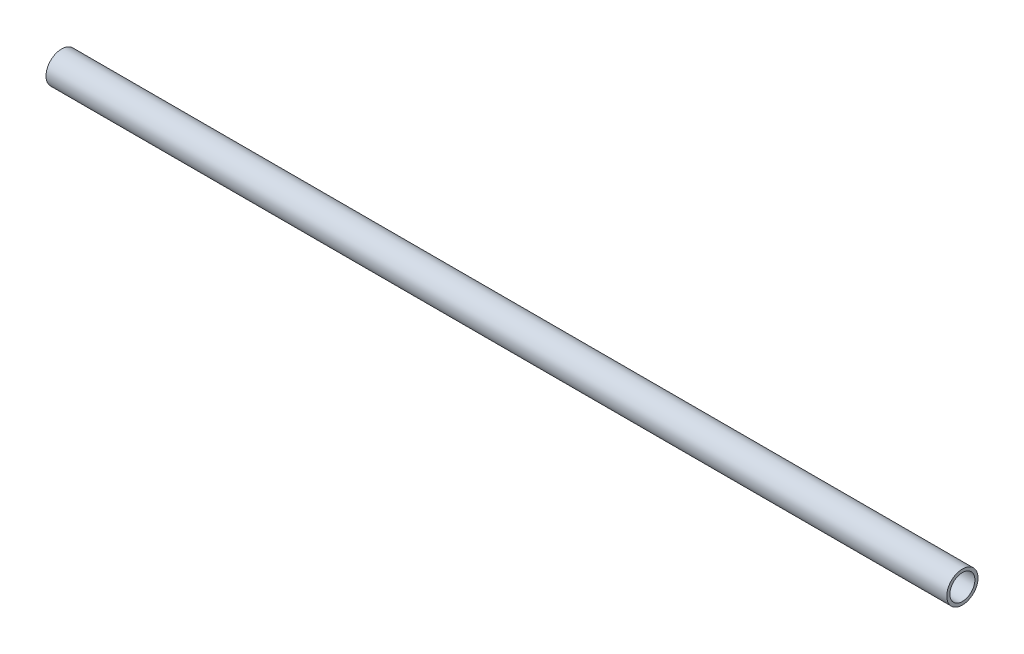
ISO-10303-21;
HEADER;
FILE_DESCRIPTION(('STEP AP214'),'2;1');
FILE_NAME('part.step','',(''),(''),'','','');
FILE_SCHEMA(('AUTOMOTIVE_DESIGN { 1 0 10303 214 1 1 1 1 }'));
ENDSEC;
DATA;
#1=APPLICATION_CONTEXT('core data for automotive mechanical design processes');
#2=APPLICATION_PROTOCOL_DEFINITION('international standard','automotive_design',2000,#1);
#3=PRODUCT_CONTEXT('',#1,'mechanical');
#4=PRODUCT('Part','Part','',(#3));
#5=PRODUCT_RELATED_PRODUCT_CATEGORY('part','',(#4));
#6=PRODUCT_DEFINITION_FORMATION('','',#4);
#7=PRODUCT_DEFINITION_CONTEXT('part definition',#1,'design');
#8=PRODUCT_DEFINITION('design','',#6,#7);
#9=PRODUCT_DEFINITION_SHAPE('','',#8);
#10=(LENGTH_UNIT() NAMED_UNIT(*) SI_UNIT(.MILLI.,.METRE.));
#11=(NAMED_UNIT(*) PLANE_ANGLE_UNIT() SI_UNIT($,.RADIAN.));
#12=(NAMED_UNIT(*) SI_UNIT($,.STERADIAN.) SOLID_ANGLE_UNIT());
#13=UNCERTAINTY_MEASURE_WITH_UNIT(LENGTH_MEASURE(1.E-05),#10,'distance_accuracy_value','');
#14=(GEOMETRIC_REPRESENTATION_CONTEXT(3) GLOBAL_UNCERTAINTY_ASSIGNED_CONTEXT((#13)) GLOBAL_UNIT_ASSIGNED_CONTEXT((#10,
#11,#12)) REPRESENTATION_CONTEXT('',''));
#15=CARTESIAN_POINT('',(0.,0.,0.));
#16=DIRECTION('',(0.,0.,1.));
#17=DIRECTION('',(1.,0.,0.));
#18=AXIS2_PLACEMENT_3D('',#15,#16,#17);
#19=CARTESIAN_POINT('',(-444.782693127749,0.,0.));
#20=DIRECTION('',(-1.,0.,0.));
#21=DIRECTION('',(0.,0.,1.));
#22=AXIS2_PLACEMENT_3D('',#19,#20,#21);
#23=CYLINDRICAL_SURFACE('',#22,12.6999999999999);
#24=CARTESIAN_POINT('',(457.2,0.,0.));
#25=DIRECTION('',(-1.,0.,0.));
#26=DIRECTION('',(0.,0.,1.));
#27=AXIS2_PLACEMENT_3D('',#24,#25,#26);
#28=CIRCLE('',#27,12.6999999999999);
#29=CARTESIAN_POINT('',(457.2,0.,12.6999999999999));
#30=VERTEX_POINT('',#29);
#31=EDGE_CURVE('E10',#30,#30,#28,.T.);
#32=ORIENTED_EDGE('',*,*,#31,.F.);
#33=EDGE_LOOP('',(#32));
#34=FACE_BOUND('',#33,.T.);
#35=CARTESIAN_POINT('',(-457.2,0.,0.));
#36=DIRECTION('',(-1.,0.,0.));
#37=DIRECTION('',(0.,0.,1.));
#38=AXIS2_PLACEMENT_3D('',#35,#36,#37);
#39=CIRCLE('',#38,12.6999999999999);
#40=CARTESIAN_POINT('',(-457.2,0.,12.6999999999999));
#41=VERTEX_POINT('',#40);
#42=EDGE_CURVE('E47',#41,#41,#39,.T.);
#43=ORIENTED_EDGE('',*,*,#42,.T.);
#44=EDGE_LOOP('',(#43));
#45=FACE_BOUND('',#44,.T.);
#46=ADVANCED_FACE('F33',(#34,#45),#23,.F.);
#47=CARTESIAN_POINT('',(457.2,12.6999999999999,0.));
#48=DIRECTION('',(-1.,0.,0.));
#49=DIRECTION('',(0.,0.,1.));
#50=AXIS2_PLACEMENT_3D('',#47,#48,#49);
#51=PLANE('',#50);
#52=CARTESIAN_POINT('',(457.2,0.,0.));
#53=DIRECTION('',(-1.,0.,0.));
#54=DIRECTION('',(0.,0.,1.));
#55=AXIS2_PLACEMENT_3D('',#52,#53,#54);
#56=CIRCLE('',#55,15.8749999999999);
#57=CARTESIAN_POINT('',(457.2,0.,15.8749999999999));
#58=VERTEX_POINT('',#57);
#59=EDGE_CURVE('E39',#58,#58,#56,.T.);
#60=ORIENTED_EDGE('',*,*,#59,.F.);
#61=EDGE_LOOP('',(#60));
#62=FACE_BOUND('',#61,.T.);
#63=ORIENTED_EDGE('',*,*,#31,.T.);
#64=EDGE_LOOP('',(#63));
#65=FACE_BOUND('',#64,.T.);
#66=ADVANCED_FACE('F62',(#62,#65),#51,.F.);
#67=CARTESIAN_POINT('',(-444.782693127749,0.,0.));
#68=DIRECTION('',(-1.,0.,0.));
#69=DIRECTION('',(0.,0.,1.));
#70=AXIS2_PLACEMENT_3D('',#67,#68,#69);
#71=CYLINDRICAL_SURFACE('',#70,15.8749999999999);
#72=CARTESIAN_POINT('',(-457.2,0.,0.));
#73=DIRECTION('',(-1.,0.,0.));
#74=DIRECTION('',(0.,0.,1.));
#75=AXIS2_PLACEMENT_3D('',#72,#73,#74);
#76=CIRCLE('',#75,15.8749999999999);
#77=CARTESIAN_POINT('',(-457.2,0.,15.8749999999999));
#78=VERTEX_POINT('',#77);
#79=EDGE_CURVE('E43',#78,#78,#76,.T.);
#80=ORIENTED_EDGE('',*,*,#79,.F.);
#81=EDGE_LOOP('',(#80));
#82=FACE_BOUND('',#81,.T.);
#83=ORIENTED_EDGE('',*,*,#59,.T.);
#84=EDGE_LOOP('',(#83));
#85=FACE_BOUND('',#84,.T.);
#86=ADVANCED_FACE('F57',(#82,#85),#71,.T.);
#87=CARTESIAN_POINT('',(-457.2,15.8749999999999,0.));
#88=DIRECTION('',(1.,0.,0.));
#89=DIRECTION('',(0.,0.,-1.));
#90=AXIS2_PLACEMENT_3D('',#87,#88,#89);
#91=PLANE('',#90);
#92=ORIENTED_EDGE('',*,*,#42,.F.);
#93=EDGE_LOOP('',(#92));
#94=FACE_BOUND('',#93,.T.);
#95=ORIENTED_EDGE('',*,*,#79,.T.);
#96=EDGE_LOOP('',(#95));
#97=FACE_BOUND('',#96,.T.);
#98=ADVANCED_FACE('F54',(#94,#97),#91,.F.);
#99=CLOSED_SHELL('',(#46,#66,#86,#98));
#100=MANIFOLD_SOLID_BREP('B2',#99);
#101=ADVANCED_BREP_SHAPE_REPRESENTATION('',(#18,#100),#14);
#102=SHAPE_DEFINITION_REPRESENTATION(#9,#101);
ENDSEC;
END-ISO-10303-21;
